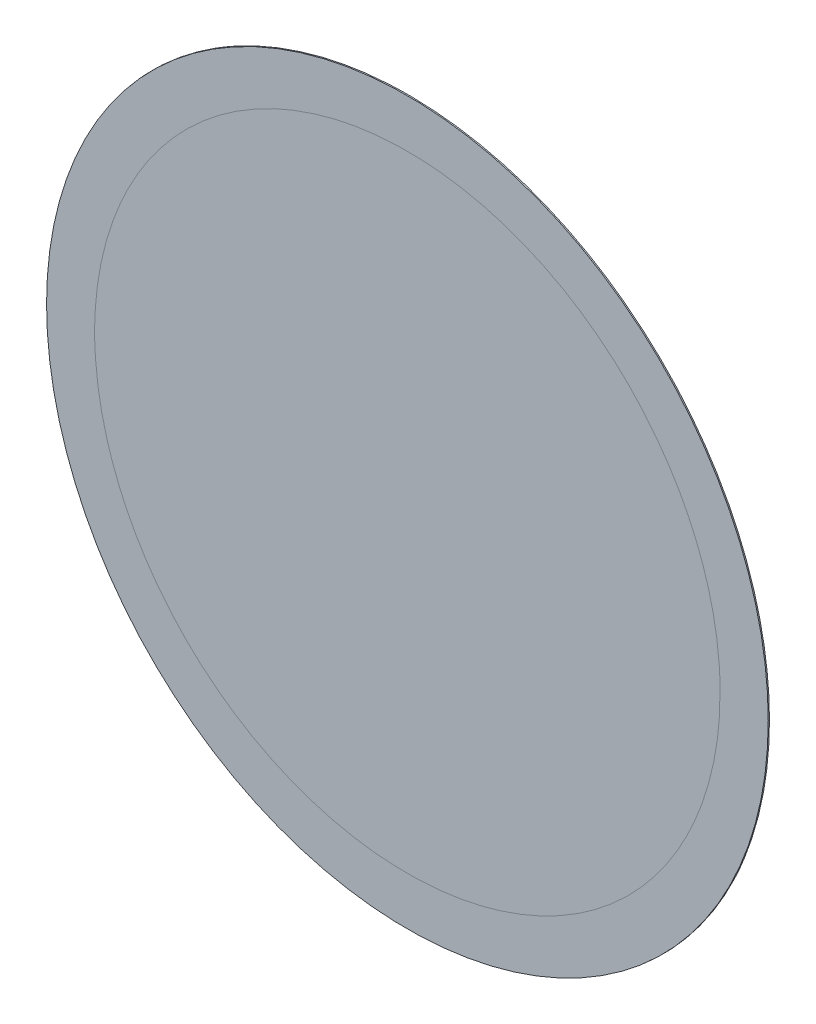
ISO-10303-21;
HEADER;
FILE_DESCRIPTION(('STEP AP214'),'2;1');
FILE_NAME('part.step','',(''),(''),'','','');
FILE_SCHEMA(('AUTOMOTIVE_DESIGN { 1 0 10303 214 1 1 1 1 }'));
ENDSEC;
DATA;
#1=APPLICATION_CONTEXT('core data for automotive mechanical design processes');
#2=APPLICATION_PROTOCOL_DEFINITION('international standard','automotive_design',2000,#1);
#3=PRODUCT_CONTEXT('',#1,'mechanical');
#4=PRODUCT('Part','Part','',(#3));
#5=PRODUCT_RELATED_PRODUCT_CATEGORY('part','',(#4));
#6=PRODUCT_DEFINITION_FORMATION('','',#4);
#7=PRODUCT_DEFINITION_CONTEXT('part definition',#1,'design');
#8=PRODUCT_DEFINITION('design','',#6,#7);
#9=PRODUCT_DEFINITION_SHAPE('','',#8);
#10=(LENGTH_UNIT() NAMED_UNIT(*) SI_UNIT(.MILLI.,.METRE.));
#11=(NAMED_UNIT(*) PLANE_ANGLE_UNIT() SI_UNIT($,.RADIAN.));
#12=(NAMED_UNIT(*) SI_UNIT($,.STERADIAN.) SOLID_ANGLE_UNIT());
#13=UNCERTAINTY_MEASURE_WITH_UNIT(LENGTH_MEASURE(1.E-05),#10,'distance_accuracy_value','');
#14=(GEOMETRIC_REPRESENTATION_CONTEXT(3) GLOBAL_UNCERTAINTY_ASSIGNED_CONTEXT((#13)) GLOBAL_UNIT_ASSIGNED_CONTEXT((#10,
#11,#12)) REPRESENTATION_CONTEXT('',''));
#15=CARTESIAN_POINT('',(0.,0.,0.));
#16=DIRECTION('',(0.,0.,1.));
#17=DIRECTION('',(1.,0.,0.));
#18=AXIS2_PLACEMENT_3D('',#15,#16,#17);
#19=CARTESIAN_POINT('',(0.,0.,0.));
#20=DIRECTION('',(0.,0.,1.));
#21=DIRECTION('',(1.,0.,0.));
#22=AXIS2_PLACEMENT_3D('',#19,#20,#21);
#23=PLANE('',#22);
#24=CARTESIAN_POINT('',(-7.5,0.,0.));
#25=CARTESIAN_POINT('',(-7.5,1.07177678586187,0.));
#26=CARTESIAN_POINT('',(-7.2,2.1,0.));
#27=CARTESIAN_POINT('',(-7.02105486991004,2.71331845605157,0.));
#28=CARTESIAN_POINT('',(-6.74157303370786,3.28651685393259,0.));
#29=CARTESIAN_POINT('',(-6.42830699075694,3.92900438145871,0.));
#30=CARTESIAN_POINT('',(-6.,4.5,0.));
#31=CARTESIAN_POINT('',(-5.52596321759958,5.13196009315584,0.));
#32=CARTESIAN_POINT('',(-4.93150684931507,5.65068493150685,0.));
#33=CARTESIAN_POINT('',(-4.28528758362632,6.2145782666915,0.));
#34=CARTESIAN_POINT('',(-3.52941176470588,6.61764705882353,0.));
#35=CARTESIAN_POINT('',(-2.72679080434279,7.04564257466825,0.));
#36=CARTESIAN_POINT('',(-1.84615384615385,7.26923076923077,0.));
#37=CARTESIAN_POINT('',(-0.936970828605173,7.50006662903691,0.));
#38=CARTESIAN_POINT('',(0.,7.5,0.));
#39=CARTESIAN_POINT('',(0.938029161944443,7.49993329570383,0.));
#40=CARTESIAN_POINT('',(1.84615384615385,7.26923076923077,0.));
#41=CARTESIAN_POINT('',(2.72775462436773,7.04526644978093,0.));
#42=CARTESIAN_POINT('',(3.52941176470588,6.61764705882353,0.));
#43=CARTESIAN_POINT('',(4.28614091696346,6.21399312383631,0.));
#44=CARTESIAN_POINT('',(4.93150684931507,5.65068493150685,0.));
#45=CARTESIAN_POINT('',(5.52666829609015,5.13119776628661,0.));
#46=CARTESIAN_POINT('',(6.,4.5,0.));
#47=CARTESIAN_POINT('',(6.42883578895227,3.9281384706443,0.));
#48=CARTESIAN_POINT('',(6.74157303370787,3.28651685393258,0.));
#49=CARTESIAN_POINT('',(7.02149814746186,2.71221364234865,0.));
#50=CARTESIAN_POINT('',(7.2,2.1,0.));
#51=CARTESIAN_POINT('',(7.5,1.07108018716305,0.));
#52=CARTESIAN_POINT('',(7.5,0.,0.));
#53=B_SPLINE_CURVE_WITH_KNOTS('',2,(#24,#25,#26,#27,#28,#29,#30,#31,#32,#33,#34,#35,#36,#37,#38,
#39,#40,#41,#42,#43,#44,#45,#46,#47,#48,#49,#50,#51,#52),.UNSPECIFIED.,.F.,.F.,(3,2,2,2,2,2,2,2,
2,2,2,2,2,2,3),(0.,0.125,0.1875,0.25,0.3125,0.375,0.4375,0.5,0.5625,0.625,0.6875,0.75,0.8125,
0.875,1.),.UNSPECIFIED.);
#54=CARTESIAN_POINT('',(-7.5,0.,0.));
#55=VERTEX_POINT('',#54);
#56=CARTESIAN_POINT('',(7.5,0.,0.));
#57=VERTEX_POINT('',#56);
#58=EDGE_CURVE('E51',#55,#57,#53,.T.);
#59=ORIENTED_EDGE('',*,*,#58,.T.);
#60=CARTESIAN_POINT('',(7.5,0.,0.));
#61=CARTESIAN_POINT('',(7.5,-1.07177678586187,0.));
#62=CARTESIAN_POINT('',(7.2,-2.1,0.));
#63=CARTESIAN_POINT('',(7.0210548699086,-2.7133184560565,0.));
#64=CARTESIAN_POINT('',(6.74157303370787,-3.28651685393258,0.));
#65=CARTESIAN_POINT('',(6.42830699075272,-3.92900438146515,0.));
#66=CARTESIAN_POINT('',(6.,-4.5,0.));
#67=CARTESIAN_POINT('',(5.52596321760045,-5.13196009315377,0.));
#68=CARTESIAN_POINT('',(4.93150684931507,-5.65068493150685,0.));
#69=CARTESIAN_POINT('',(4.28528758363208,-6.21457826668788,0.));
#70=CARTESIAN_POINT('',(3.52941176470588,-6.61764705882353,0.));
#71=CARTESIAN_POINT('',(2.72679080434771,-7.0456425746662,0.));
#72=CARTESIAN_POINT('',(1.84615384615385,-7.26923076923077,0.));
#73=CARTESIAN_POINT('',(0.936970828608413,-7.50006662903691,0.));
#74=CARTESIAN_POINT('',(0.,-7.5,0.));
#75=CARTESIAN_POINT('',(-0.938029161943859,-7.49993329570383,0.));
#76=CARTESIAN_POINT('',(-1.84615384615385,-7.26923076923077,0.));
#77=CARTESIAN_POINT('',(-2.7277546243616,-7.04526644978263,0.));
#78=CARTESIAN_POINT('',(-3.52941176470588,-6.61764705882353,0.));
#79=CARTESIAN_POINT('',(-4.28614091695493,-6.21399312384234,0.));
#80=CARTESIAN_POINT('',(-4.93150684931507,-5.65068493150685,0.));
#81=CARTESIAN_POINT('',(-5.52666829608537,-5.13119776629207,0.));
#82=CARTESIAN_POINT('',(-6.,-4.5,0.));
#83=CARTESIAN_POINT('',(-6.4288357889507,-3.92813847064721,0.));
#84=CARTESIAN_POINT('',(-6.74157303370787,-3.28651685393258,0.));
#85=CARTESIAN_POINT('',(-7.02149814746166,-2.71221364234933,0.));
#86=CARTESIAN_POINT('',(-7.2,-2.1,0.));
#87=CARTESIAN_POINT('',(-7.5,-1.07108018716305,0.));
#88=CARTESIAN_POINT('',(-7.5,0.,0.));
#89=B_SPLINE_CURVE_WITH_KNOTS('',2,(#60,#61,#62,#63,#64,#65,#66,#67,#68,#69,#70,#71,#72,#73,#74,
#75,#76,#77,#78,#79,#80,#81,#82,#83,#84,#85,#86,#87,#88),.UNSPECIFIED.,.F.,.F.,(3,2,2,2,2,2,2,2,
2,2,2,2,2,2,3),(0.,0.125,0.1875,0.25,0.3125,0.375,0.4375,0.5,0.5625,0.625,0.6875,0.75,0.8125,
0.875,1.),.UNSPECIFIED.);
#90=EDGE_CURVE('E48',#57,#55,#89,.T.);
#91=ORIENTED_EDGE('',*,*,#90,.T.);
#92=EDGE_LOOP('',(#59,#91));
#93=FACE_BOUND('',#92,.T.);
#94=ADVANCED_FACE('F17',(#93),#23,.F.);
#95=CARTESIAN_POINT('',(0.,0.,0.));
#96=DIRECTION('',(0.,0.,1.));
#97=DIRECTION('',(1.,0.,0.));
#98=AXIS2_PLACEMENT_3D('',#95,#96,#97);
#99=CYLINDRICAL_SURFACE('',#98,7.5);
#100=ORIENTED_EDGE('',*,*,#58,.F.);
#101=ORIENTED_EDGE('',*,*,#90,.F.);
#102=EDGE_LOOP('',(#100,#101));
#103=FACE_BOUND('',#102,.T.);
#104=CARTESIAN_POINT('',(0.,0.,0.025));
#105=DIRECTION('',(0.,0.,-1.));
#106=DIRECTION('',(1.,0.,0.));
#107=AXIS2_PLACEMENT_3D('',#104,#105,#106);
#108=CIRCLE('',#107,7.5);
#109=CARTESIAN_POINT('',(7.5,0.,0.025));
#110=VERTEX_POINT('',#109);
#111=CARTESIAN_POINT('',(-7.5,0.,0.025));
#112=VERTEX_POINT('',#111);
#113=EDGE_CURVE('E55',#110,#112,#108,.T.);
#114=ORIENTED_EDGE('',*,*,#113,.T.);
#115=CARTESIAN_POINT('',(0.,0.,0.025));
#116=DIRECTION('',(0.,0.,-1.));
#117=DIRECTION('',(-1.,0.,0.));
#118=AXIS2_PLACEMENT_3D('',#115,#116,#117);
#119=CIRCLE('',#118,7.5);
#120=EDGE_CURVE('E91',#112,#110,#119,.T.);
#121=ORIENTED_EDGE('',*,*,#120,.T.);
#122=EDGE_LOOP('',(#114,#121));
#123=FACE_BOUND('',#122,.T.);
#124=ADVANCED_FACE('F59',(#103,#123),#99,.T.);
#125=CARTESIAN_POINT('',(0.,0.,0.025));
#126=DIRECTION('',(0.,0.,1.));
#127=DIRECTION('',(1.,0.,0.));
#128=AXIS2_PLACEMENT_3D('',#125,#126,#127);
#129=PLANE('',#128);
#130=CARTESIAN_POINT('',(6.5,0.,0.025));
#131=CARTESIAN_POINT('',(6.5,-0.928919629941381,0.025));
#132=CARTESIAN_POINT('',(6.24,-1.82,0.025));
#133=CARTESIAN_POINT('',(6.0848846437462,-2.35161634250927,0.025));
#134=CARTESIAN_POINT('',(5.84269662921348,-2.84831460674157,0.025));
#135=CARTESIAN_POINT('',(5.57116412765835,-3.40519485725813,0.025));
#136=CARTESIAN_POINT('',(5.2,-3.9,0.025));
#137=CARTESIAN_POINT('',(4.78912110731896,-4.44774956412221,0.025));
#138=CARTESIAN_POINT('',(4.27397260273973,-4.8972602739726,0.025));
#139=CARTESIAN_POINT('',(3.71385900675266,-5.38600683518925,0.025));
#140=CARTESIAN_POINT('',(3.05882352941176,-5.73529411764706,0.025));
#141=CARTESIAN_POINT('',(2.36315443873126,-6.10624863015697,0.025));
#142=CARTESIAN_POINT('',(1.6,-6.3,0.025));
#143=CARTESIAN_POINT('',(0.811970827881541,-6.5000666232487,0.025));
#144=CARTESIAN_POINT('',(0.,-6.5,0.025));
#145=CARTESIAN_POINT('',(-0.813029161218835,-6.49993328991369,0.025));
#146=CARTESIAN_POINT('',(-1.6,-6.3,0.025));
#147=CARTESIAN_POINT('',(-2.36411825874051,-6.10587250527641,0.025));
#148=CARTESIAN_POINT('',(-3.05882352941177,-5.73529411764706,0.025));
#149=CARTESIAN_POINT('',(-3.71471234008714,-5.38542169233875,0.025));
#150=CARTESIAN_POINT('',(-4.27397260273973,-4.8972602739726,0.025));
#151=CARTESIAN_POINT('',(-4.78982618581258,-4.44698723725135,0.025));
#152=CARTESIAN_POINT('',(-5.2,-3.9,0.025));
#153=CARTESIAN_POINT('',(-5.57169292584882,-3.40432894645241,0.025));
#154=CARTESIAN_POINT('',(-5.84269662921348,-2.84831460674157,0.025));
#155=CARTESIAN_POINT('',(-6.08532792130599,-2.3505115288092,0.025));
#156=CARTESIAN_POINT('',(-6.24,-1.82,0.025));
#157=CARTESIAN_POINT('',(-6.5,-0.9282230312346,0.025));
#158=CARTESIAN_POINT('',(-6.5,0.,0.025));
#159=B_SPLINE_CURVE_WITH_KNOTS('',2,(#130,#131,#132,#133,#134,#135,#136,#137,#138,#139,#140,
#141,#142,#143,#144,#145,#146,#147,#148,#149,#150,#151,#152,#153,#154,#155,#156,#157,#158),
.UNSPECIFIED.,.F.,.F.,(3,2,2,2,2,2,2,2,2,2,2,2,2,2,3),(0.,0.125,0.1875,0.25,0.3125,0.375,0.4375,
0.5,0.5625,0.625,0.6875,0.75,0.8125,0.875,1.),.UNSPECIFIED.);
#160=CARTESIAN_POINT('',(6.5,0.,0.03));
#161=VERTEX_POINT('',#160);
#162=CARTESIAN_POINT('',(-6.5,0.,0.03));
#163=VERTEX_POINT('',#162);
#164=EDGE_CURVE('E28',#161,#163,#159,.T.);
#165=ORIENTED_EDGE('',*,*,#164,.T.);
#166=CARTESIAN_POINT('',(-6.5,0.,0.025));
#167=CARTESIAN_POINT('',(-6.5,0.928919629941382,0.025));
#168=CARTESIAN_POINT('',(-6.24,1.82,0.025));
#169=CARTESIAN_POINT('',(-6.08488464374603,2.35161634250986,0.025));
#170=CARTESIAN_POINT('',(-5.84269662921348,2.84831460674157,0.025));
#171=CARTESIAN_POINT('',(-5.57116412765909,3.40519485725636,0.025));
#172=CARTESIAN_POINT('',(-5.2,3.9,0.025));
#173=CARTESIAN_POINT('',(-4.78912110731857,4.44774956412361,0.025));
#174=CARTESIAN_POINT('',(-4.27397260273973,4.8972602739726,0.025));
#175=CARTESIAN_POINT('',(-3.71385900674499,5.3860068351948,0.025));
#176=CARTESIAN_POINT('',(-3.05882352941176,5.73529411764706,0.025));
#177=CARTESIAN_POINT('',(-2.36315443872559,6.10624863015845,0.025));
#178=CARTESIAN_POINT('',(-1.6,6.3,0.025));
#179=CARTESIAN_POINT('',(-0.811970827886573,6.50006662324738,0.025));
#180=CARTESIAN_POINT('',(0.,6.5,0.025));
#181=CARTESIAN_POINT('',(0.813029161215436,6.49993328991501,0.025));
#182=CARTESIAN_POINT('',(1.6,6.3,0.025));
#183=CARTESIAN_POINT('',(2.36411825874079,6.1058725052759,0.025));
#184=CARTESIAN_POINT('',(3.05882352941176,5.73529411764706,0.025));
#185=CARTESIAN_POINT('',(3.71471234009085,5.38542169233712,0.025));
#186=CARTESIAN_POINT('',(4.27397260273973,4.8972602739726,0.025));
#187=CARTESIAN_POINT('',(4.78982618581112,4.44698723725114,0.025));
#188=CARTESIAN_POINT('',(5.2,3.9,0.025));
#189=CARTESIAN_POINT('',(5.57169292584649,3.40432894645746,0.025));
#190=CARTESIAN_POINT('',(5.84269662921348,2.84831460674157,0.025));
#191=CARTESIAN_POINT('',(6.08532792130603,2.35051152880887,0.025));
#192=CARTESIAN_POINT('',(6.24,1.82,0.025));
#193=CARTESIAN_POINT('',(6.5,0.928223031234892,0.025));
#194=CARTESIAN_POINT('',(6.5,0.,0.025));
#195=B_SPLINE_CURVE_WITH_KNOTS('',2,(#166,#167,#168,#169,#170,#171,#172,#173,#174,#175,#176,
#177,#178,#179,#180,#181,#182,#183,#184,#185,#186,#187,#188,#189,#190,#191,#192,#193,#194),
.UNSPECIFIED.,.F.,.F.,(3,2,2,2,2,2,2,2,2,2,2,2,2,2,3),(0.,0.125,0.1875,0.25,0.3125,0.375,0.4375,
0.5,0.5625,0.625,0.6875,0.75,0.8125,0.875,1.),.UNSPECIFIED.);
#196=EDGE_CURVE('E11',#163,#161,#195,.T.);
#197=ORIENTED_EDGE('',*,*,#196,.T.);
#198=EDGE_LOOP('',(#165,#197));
#199=FACE_BOUND('',#198,.T.);
#200=ORIENTED_EDGE('',*,*,#113,.F.);
#201=ORIENTED_EDGE('',*,*,#120,.F.);
#202=EDGE_LOOP('',(#200,#201));
#203=FACE_BOUND('',#202,.T.);
#204=ADVANCED_FACE('F75',(#199,#203),#129,.T.);
#205=CARTESIAN_POINT('',(0.,0.,0.035));
#206=DIRECTION('',(0.,0.,1.));
#207=DIRECTION('',(1.,0.,0.));
#208=AXIS2_PLACEMENT_3D('',#205,#206,#207);
#209=PLANE('',#208);
#210=ORIENTED_EDGE('',*,*,#164,.F.);
#211=ORIENTED_EDGE('',*,*,#196,.F.);
#212=EDGE_LOOP('',(#210,#211));
#213=FACE_BOUND('',#212,.T.);
#214=ADVANCED_FACE('F133',(#213),#209,.T.);
#215=CLOSED_SHELL('',(#94,#124,#204,#214));
#216=MANIFOLD_SOLID_BREP('B1',#215);
#217=ADVANCED_BREP_SHAPE_REPRESENTATION('',(#18,#216),#14);
#218=SHAPE_DEFINITION_REPRESENTATION(#9,#217);
ENDSEC;
END-ISO-10303-21;
